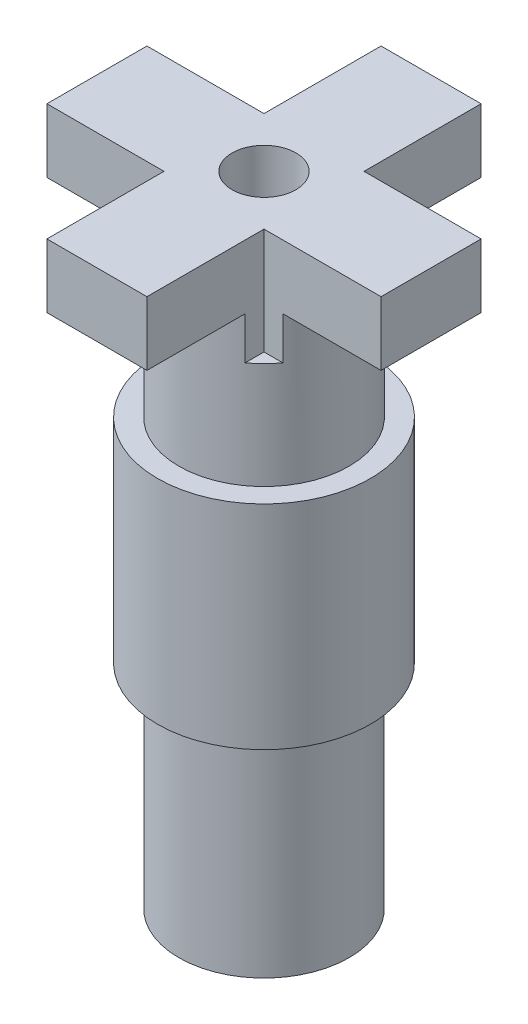
ISO-10303-21;
HEADER;
FILE_DESCRIPTION(('STEP AP214'),'2;1');
FILE_NAME('part.step','',(''),(''),'','','');
FILE_SCHEMA(('AUTOMOTIVE_DESIGN { 1 0 10303 214 1 1 1 1 }'));
ENDSEC;
DATA;
#1=APPLICATION_CONTEXT('core data for automotive mechanical design processes');
#2=APPLICATION_PROTOCOL_DEFINITION('international standard','automotive_design',2000,#1);
#3=PRODUCT_CONTEXT('',#1,'mechanical');
#4=PRODUCT('Part','Part','',(#3));
#5=PRODUCT_RELATED_PRODUCT_CATEGORY('part','',(#4));
#6=PRODUCT_DEFINITION_FORMATION('','',#4);
#7=PRODUCT_DEFINITION_CONTEXT('part definition',#1,'design');
#8=PRODUCT_DEFINITION('design','',#6,#7);
#9=PRODUCT_DEFINITION_SHAPE('','',#8);
#10=(LENGTH_UNIT() NAMED_UNIT(*) SI_UNIT(.MILLI.,.METRE.));
#11=(NAMED_UNIT(*) PLANE_ANGLE_UNIT() SI_UNIT($,.RADIAN.));
#12=(NAMED_UNIT(*) SI_UNIT($,.STERADIAN.) SOLID_ANGLE_UNIT());
#13=UNCERTAINTY_MEASURE_WITH_UNIT(LENGTH_MEASURE(1.E-05),#10,'distance_accuracy_value','');
#14=(GEOMETRIC_REPRESENTATION_CONTEXT(3) GLOBAL_UNCERTAINTY_ASSIGNED_CONTEXT((#13)) GLOBAL_UNIT_ASSIGNED_CONTEXT((#10,
#11,#12)) REPRESENTATION_CONTEXT('',''));
#15=CARTESIAN_POINT('',(0.,0.,0.));
#16=DIRECTION('',(0.,0.,1.));
#17=DIRECTION('',(1.,0.,0.));
#18=AXIS2_PLACEMENT_3D('',#15,#16,#17);
#19=CARTESIAN_POINT('',(0.,20.,0.));
#20=DIRECTION('',(0.,-1.,0.));
#21=DIRECTION('',(0.,0.,-1.));
#22=AXIS2_PLACEMENT_3D('',#19,#20,#21);
#23=CYLINDRICAL_SURFACE('',#22,4.);
#24=CARTESIAN_POINT('',(0.,10.,0.));
#25=DIRECTION('',(0.,1.,0.));
#26=DIRECTION('',(0.,0.,1.));
#27=AXIS2_PLACEMENT_3D('',#24,#25,#26);
#28=CIRCLE('',#27,4.);
#29=CARTESIAN_POINT('',(0.,10.,4.));
#30=VERTEX_POINT('',#29);
#31=EDGE_CURVE('E243',#30,#30,#28,.T.);
#32=ORIENTED_EDGE('',*,*,#31,.T.);
#33=EDGE_LOOP('',(#32));
#34=FACE_BOUND('',#33,.T.);
#35=DIRECTION('',(0.,1.,0.));
#36=VECTOR('',#35,1.);
#37=CARTESIAN_POINT('',(-2.35,15.,-3.2368966619279));
#38=LINE('',#37,#36);
#39=CARTESIAN_POINT('',(-2.35,15.,-3.2368966619279));
#40=VERTEX_POINT('',#39);
#41=CARTESIAN_POINT('',(-2.35,17.,-3.2368966619279));
#42=VERTEX_POINT('',#41);
#43=EDGE_CURVE('E423',#40,#42,#38,.T.);
#44=ORIENTED_EDGE('',*,*,#43,.T.);
#45=CARTESIAN_POINT('',(0.,17.,0.));
#46=DIRECTION('',(0.,1.,0.));
#47=DIRECTION('',(0.,0.,1.));
#48=AXIS2_PLACEMENT_3D('',#45,#46,#47);
#49=CIRCLE('',#48,4.);
#50=CARTESIAN_POINT('',(2.35,17.,-3.2368966619279));
#51=VERTEX_POINT('',#50);
#52=EDGE_CURVE('E57',#51,#42,#49,.T.);
#53=ORIENTED_EDGE('',*,*,#52,.F.);
#54=DIRECTION('',(0.,1.,0.));
#55=VECTOR('',#54,1.);
#56=CARTESIAN_POINT('',(2.35,15.,-3.2368966619279));
#57=LINE('',#56,#55);
#58=CARTESIAN_POINT('',(2.35,15.,-3.2368966619279));
#59=VERTEX_POINT('',#58);
#60=EDGE_CURVE('E370',#59,#51,#57,.T.);
#61=ORIENTED_EDGE('',*,*,#60,.F.);
#62=CARTESIAN_POINT('',(0.,15.,0.));
#63=DIRECTION('',(0.,1.,0.));
#64=DIRECTION('',(0.,0.,1.));
#65=AXIS2_PLACEMENT_3D('',#62,#63,#64);
#66=CIRCLE('',#65,4.);
#67=CARTESIAN_POINT('',(3.2368966619279,15.,-2.35));
#68=VERTEX_POINT('',#67);
#69=EDGE_CURVE('E397',#68,#59,#66,.T.);
#70=ORIENTED_EDGE('',*,*,#69,.F.);
#71=DIRECTION('',(0.,1.,0.));
#72=VECTOR('',#71,1.);
#73=CARTESIAN_POINT('',(3.2368966619279,15.,-2.35));
#74=LINE('',#73,#72);
#75=CARTESIAN_POINT('',(3.2368966619279,17.,-2.35));
#76=VERTEX_POINT('',#75);
#77=EDGE_CURVE('E405',#68,#76,#74,.T.);
#78=ORIENTED_EDGE('',*,*,#77,.T.);
#79=CARTESIAN_POINT('',(3.2368966619279,17.,2.35));
#80=VERTEX_POINT('',#79);
#81=EDGE_CURVE('E11',#80,#76,#49,.T.);
#82=ORIENTED_EDGE('',*,*,#81,.F.);
#83=DIRECTION('',(0.,1.,0.));
#84=VECTOR('',#83,1.);
#85=CARTESIAN_POINT('',(3.2368966619279,15.,2.35));
#86=LINE('',#85,#84);
#87=CARTESIAN_POINT('',(3.2368966619279,15.,2.35));
#88=VERTEX_POINT('',#87);
#89=EDGE_CURVE('E64',#88,#80,#86,.T.);
#90=ORIENTED_EDGE('',*,*,#89,.F.);
#91=CARTESIAN_POINT('',(0.,15.,0.));
#92=DIRECTION('',(0.,1.,0.));
#93=DIRECTION('',(0.,0.,1.));
#94=AXIS2_PLACEMENT_3D('',#91,#92,#93);
#95=CIRCLE('',#94,4.);
#96=CARTESIAN_POINT('',(2.35,15.,3.2368966619279));
#97=VERTEX_POINT('',#96);
#98=EDGE_CURVE('E369',#97,#88,#95,.T.);
#99=ORIENTED_EDGE('',*,*,#98,.F.);
#100=DIRECTION('',(0.,1.,0.));
#101=VECTOR('',#100,1.);
#102=CARTESIAN_POINT('',(2.35,15.,3.2368966619279));
#103=LINE('',#102,#101);
#104=CARTESIAN_POINT('',(2.35,17.,3.2368966619279));
#105=VERTEX_POINT('',#104);
#106=EDGE_CURVE('E378',#97,#105,#103,.T.);
#107=ORIENTED_EDGE('',*,*,#106,.T.);
#108=CARTESIAN_POINT('',(-2.35,17.,3.2368966619279));
#109=VERTEX_POINT('',#108);
#110=EDGE_CURVE('E51',#109,#105,#49,.T.);
#111=ORIENTED_EDGE('',*,*,#110,.F.);
#112=DIRECTION('',(0.,1.,0.));
#113=VECTOR('',#112,1.);
#114=CARTESIAN_POINT('',(-2.35,15.,3.2368966619279));
#115=LINE('',#114,#113);
#116=CARTESIAN_POINT('',(-2.35,15.,3.2368966619279));
#117=VERTEX_POINT('',#116);
#118=EDGE_CURVE('E176',#117,#109,#115,.T.);
#119=ORIENTED_EDGE('',*,*,#118,.F.);
#120=CARTESIAN_POINT('',(0.,15.,0.));
#121=DIRECTION('',(0.,1.,0.));
#122=DIRECTION('',(0.,0.,1.));
#123=AXIS2_PLACEMENT_3D('',#120,#121,#122);
#124=CIRCLE('',#123,4.);
#125=CARTESIAN_POINT('',(-3.2368966619279,15.,2.35));
#126=VERTEX_POINT('',#125);
#127=EDGE_CURVE('E441',#126,#117,#124,.T.);
#128=ORIENTED_EDGE('',*,*,#127,.F.);
#129=DIRECTION('',(0.,1.,0.));
#130=VECTOR('',#129,1.);
#131=CARTESIAN_POINT('',(-3.2368966619279,15.,2.35));
#132=LINE('',#131,#130);
#133=CARTESIAN_POINT('',(-3.2368966619279,17.,2.35));
#134=VERTEX_POINT('',#133);
#135=EDGE_CURVE('E449',#126,#134,#132,.T.);
#136=ORIENTED_EDGE('',*,*,#135,.T.);
#137=CARTESIAN_POINT('',(-3.2368966619279,17.,-2.35));
#138=VERTEX_POINT('',#137);
#139=EDGE_CURVE('E160',#138,#134,#49,.T.);
#140=ORIENTED_EDGE('',*,*,#139,.F.);
#141=DIRECTION('',(0.,1.,0.));
#142=VECTOR('',#141,1.);
#143=CARTESIAN_POINT('',(-3.2368966619279,15.,-2.35));
#144=LINE('',#143,#142);
#145=CARTESIAN_POINT('',(-3.2368966619279,15.,-2.35));
#146=VERTEX_POINT('',#145);
#147=EDGE_CURVE('E427',#146,#138,#144,.T.);
#148=ORIENTED_EDGE('',*,*,#147,.F.);
#149=CARTESIAN_POINT('',(0.,15.,0.));
#150=DIRECTION('',(0.,1.,0.));
#151=DIRECTION('',(0.,0.,1.));
#152=AXIS2_PLACEMENT_3D('',#149,#150,#151);
#153=CIRCLE('',#152,4.);
#154=EDGE_CURVE('E415',#40,#146,#153,.T.);
#155=ORIENTED_EDGE('',*,*,#154,.F.);
#156=EDGE_LOOP('',(#44,#53,#61,#70,#78,#82,#90,#99,#107,#111,#119,#128,#136,#140,#148,#155));
#157=FACE_BOUND('',#156,.T.);
#158=ADVANCED_FACE('F47',(#34,#157),#23,.T.);
#159=CARTESIAN_POINT('',(0.,20.,0.));
#160=DIRECTION('',(0.,1.,0.));
#161=DIRECTION('',(0.,0.,1.));
#162=AXIS2_PLACEMENT_3D('',#159,#160,#161);
#163=PLANE('',#162);
#164=CARTESIAN_POINT('',(0.,20.,0.));
#165=DIRECTION('',(0.,1.,0.));
#166=DIRECTION('',(0.,0.,1.));
#167=AXIS2_PLACEMENT_3D('',#164,#165,#166);
#168=CIRCLE('',#167,1.5);
#169=CARTESIAN_POINT('',(0.,20.,1.5));
#170=VERTEX_POINT('',#169);
#171=EDGE_CURVE('E358',#170,#170,#168,.T.);
#172=ORIENTED_EDGE('',*,*,#171,.F.);
#173=EDGE_LOOP('',(#172));
#174=FACE_BOUND('',#173,.T.);
#175=DIRECTION('',(0.,0.,1.));
#176=VECTOR('',#175,1.);
#177=CARTESIAN_POINT('',(-2.35,20.,0.));
#178=LINE('',#177,#176);
#179=CARTESIAN_POINT('',(-2.35,20.,-7.85));
#180=VERTEX_POINT('',#179);
#181=CARTESIAN_POINT('',(-2.35,20.,-2.35));
#182=VERTEX_POINT('',#181);
#183=EDGE_CURVE('E193',#180,#182,#178,.T.);
#184=ORIENTED_EDGE('',*,*,#183,.T.);
#185=DIRECTION('',(1.,0.,0.));
#186=VECTOR('',#185,1.);
#187=CARTESIAN_POINT('',(0.,20.,-2.35));
#188=LINE('',#187,#186);
#189=CARTESIAN_POINT('',(-7.85,20.,-2.35));
#190=VERTEX_POINT('',#189);
#191=EDGE_CURVE('E197',#190,#182,#188,.T.);
#192=ORIENTED_EDGE('',*,*,#191,.F.);
#193=DIRECTION('',(0.,0.,-1.));
#194=VECTOR('',#193,1.);
#195=CARTESIAN_POINT('',(-7.85,20.,0.));
#196=LINE('',#195,#194);
#197=CARTESIAN_POINT('',(-7.85,20.,2.35));
#198=VERTEX_POINT('',#197);
#199=EDGE_CURVE('E201',#198,#190,#196,.T.);
#200=ORIENTED_EDGE('',*,*,#199,.F.);
#201=DIRECTION('',(1.,0.,0.));
#202=VECTOR('',#201,1.);
#203=CARTESIAN_POINT('',(0.,20.,2.35));
#204=LINE('',#203,#202);
#205=CARTESIAN_POINT('',(-2.35,20.,2.35));
#206=VERTEX_POINT('',#205);
#207=EDGE_CURVE('E140',#198,#206,#204,.T.);
#208=ORIENTED_EDGE('',*,*,#207,.T.);
#209=DIRECTION('',(0.,0.,1.));
#210=VECTOR('',#209,1.);
#211=CARTESIAN_POINT('',(-2.35,20.,0.));
#212=LINE('',#211,#210);
#213=CARTESIAN_POINT('',(-2.35,20.,7.85));
#214=VERTEX_POINT('',#213);
#215=EDGE_CURVE('E206',#206,#214,#212,.T.);
#216=ORIENTED_EDGE('',*,*,#215,.T.);
#217=DIRECTION('',(1.,0.,0.));
#218=VECTOR('',#217,1.);
#219=CARTESIAN_POINT('',(0.,20.,7.85));
#220=LINE('',#219,#218);
#221=CARTESIAN_POINT('',(2.35,20.,7.85));
#222=VERTEX_POINT('',#221);
#223=EDGE_CURVE('E209',#214,#222,#220,.T.);
#224=ORIENTED_EDGE('',*,*,#223,.T.);
#225=DIRECTION('',(0.,0.,1.));
#226=VECTOR('',#225,1.);
#227=CARTESIAN_POINT('',(2.35,20.,0.));
#228=LINE('',#227,#226);
#229=CARTESIAN_POINT('',(2.35,20.,2.35));
#230=VERTEX_POINT('',#229);
#231=EDGE_CURVE('E107',#230,#222,#228,.T.);
#232=ORIENTED_EDGE('',*,*,#231,.F.);
#233=DIRECTION('',(1.,0.,0.));
#234=VECTOR('',#233,1.);
#235=CARTESIAN_POINT('',(0.,20.,2.35));
#236=LINE('',#235,#234);
#237=CARTESIAN_POINT('',(7.85,20.,2.35));
#238=VERTEX_POINT('',#237);
#239=EDGE_CURVE('E175',#230,#238,#236,.T.);
#240=ORIENTED_EDGE('',*,*,#239,.T.);
#241=DIRECTION('',(0.,0.,-1.));
#242=VECTOR('',#241,1.);
#243=CARTESIAN_POINT('',(7.85,20.,0.));
#244=LINE('',#243,#242);
#245=CARTESIAN_POINT('',(7.85,20.,-2.35));
#246=VERTEX_POINT('',#245);
#247=EDGE_CURVE('E179',#238,#246,#244,.T.);
#248=ORIENTED_EDGE('',*,*,#247,.T.);
#249=DIRECTION('',(1.,0.,0.));
#250=VECTOR('',#249,1.);
#251=CARTESIAN_POINT('',(0.,20.,-2.35));
#252=LINE('',#251,#250);
#253=CARTESIAN_POINT('',(2.35,20.,-2.35));
#254=VERTEX_POINT('',#253);
#255=EDGE_CURVE('E183',#254,#246,#252,.T.);
#256=ORIENTED_EDGE('',*,*,#255,.F.);
#257=DIRECTION('',(0.,0.,1.));
#258=VECTOR('',#257,1.);
#259=CARTESIAN_POINT('',(2.35,20.,0.));
#260=LINE('',#259,#258);
#261=CARTESIAN_POINT('',(2.35,20.,-7.85));
#262=VERTEX_POINT('',#261);
#263=EDGE_CURVE('E186',#262,#254,#260,.T.);
#264=ORIENTED_EDGE('',*,*,#263,.F.);
#265=DIRECTION('',(1.,0.,0.));
#266=VECTOR('',#265,1.);
#267=CARTESIAN_POINT('',(0.,20.,-7.85));
#268=LINE('',#267,#266);
#269=EDGE_CURVE('E190',#180,#262,#268,.T.);
#270=ORIENTED_EDGE('',*,*,#269,.F.);
#271=EDGE_LOOP('',(#184,#192,#200,#208,#216,#224,#232,#240,#248,#256,#264,#270));
#272=FACE_BOUND('',#271,.T.);
#273=ADVANCED_FACE('F271',(#174,#272),#163,.T.);
#274=CARTESIAN_POINT('',(0.,10.,0.));
#275=DIRECTION('',(0.,-1.,0.));
#276=DIRECTION('',(0.,0.,-1.));
#277=AXIS2_PLACEMENT_3D('',#274,#275,#276);
#278=CYLINDRICAL_SURFACE('',#277,5.);
#279=CARTESIAN_POINT('',(0.,10.,0.));
#280=DIRECTION('',(0.,1.,0.));
#281=DIRECTION('',(0.,0.,1.));
#282=AXIS2_PLACEMENT_3D('',#279,#280,#281);
#283=CIRCLE('',#282,5.);
#284=CARTESIAN_POINT('',(0.,10.,5.));
#285=VERTEX_POINT('',#284);
#286=EDGE_CURVE('E247',#285,#285,#283,.T.);
#287=ORIENTED_EDGE('',*,*,#286,.F.);
#288=EDGE_LOOP('',(#287));
#289=FACE_BOUND('',#288,.T.);
#290=CARTESIAN_POINT('',(0.,0.,0.));
#291=DIRECTION('',(0.,1.,0.));
#292=DIRECTION('',(0.,0.,1.));
#293=AXIS2_PLACEMENT_3D('',#290,#291,#292);
#294=CIRCLE('',#293,5.);
#295=CARTESIAN_POINT('',(0.,0.,5.));
#296=VERTEX_POINT('',#295);
#297=EDGE_CURVE('E238',#296,#296,#294,.T.);
#298=ORIENTED_EDGE('',*,*,#297,.T.);
#299=EDGE_LOOP('',(#298));
#300=FACE_BOUND('',#299,.T.);
#301=ADVANCED_FACE('F49',(#289,#300),#278,.T.);
#302=CARTESIAN_POINT('',(0.,10.,0.));
#303=DIRECTION('',(0.,1.,0.));
#304=DIRECTION('',(0.,0.,1.));
#305=AXIS2_PLACEMENT_3D('',#302,#303,#304);
#306=PLANE('',#305);
#307=ORIENTED_EDGE('',*,*,#31,.F.);
#308=EDGE_LOOP('',(#307));
#309=FACE_BOUND('',#308,.T.);
#310=ORIENTED_EDGE('',*,*,#286,.T.);
#311=EDGE_LOOP('',(#310));
#312=FACE_BOUND('',#311,.T.);
#313=ADVANCED_FACE('F258',(#309,#312),#306,.T.);
#314=CARTESIAN_POINT('',(0.,0.,0.));
#315=DIRECTION('',(0.,1.,0.));
#316=DIRECTION('',(0.,0.,1.));
#317=AXIS2_PLACEMENT_3D('',#314,#315,#316);
#318=PLANE('',#317);
#319=CARTESIAN_POINT('',(0.,0.,0.));
#320=DIRECTION('',(0.,-1.,0.));
#321=DIRECTION('',(0.,0.,-1.));
#322=AXIS2_PLACEMENT_3D('',#319,#320,#321);
#323=CIRCLE('',#322,4.);
#324=CARTESIAN_POINT('',(0.,0.,-4.));
#325=VERTEX_POINT('',#324);
#326=EDGE_CURVE('E239',#325,#325,#323,.T.);
#327=ORIENTED_EDGE('',*,*,#326,.F.);
#328=EDGE_LOOP('',(#327));
#329=FACE_BOUND('',#328,.T.);
#330=ORIENTED_EDGE('',*,*,#297,.F.);
#331=EDGE_LOOP('',(#330));
#332=FACE_BOUND('',#331,.T.);
#333=ADVANCED_FACE('F255',(#329,#332),#318,.F.);
#334=CARTESIAN_POINT('',(0.,-10.,0.));
#335=DIRECTION('',(0.,1.,0.));
#336=DIRECTION('',(0.,0.,1.));
#337=AXIS2_PLACEMENT_3D('',#334,#335,#336);
#338=CYLINDRICAL_SURFACE('',#337,4.);
#339=CARTESIAN_POINT('',(0.,-10.,0.));
#340=DIRECTION('',(0.,-1.,0.));
#341=DIRECTION('',(0.,0.,-1.));
#342=AXIS2_PLACEMENT_3D('',#339,#340,#341);
#343=CIRCLE('',#342,4.);
#344=CARTESIAN_POINT('',(0.,-10.,-4.));
#345=VERTEX_POINT('',#344);
#346=EDGE_CURVE('E216',#345,#345,#343,.T.);
#347=ORIENTED_EDGE('',*,*,#346,.F.);
#348=EDGE_LOOP('',(#347));
#349=FACE_BOUND('',#348,.T.);
#350=ORIENTED_EDGE('',*,*,#326,.T.);
#351=EDGE_LOOP('',(#350));
#352=FACE_BOUND('',#351,.T.);
#353=ADVANCED_FACE('F257',(#349,#352),#338,.T.);
#354=CARTESIAN_POINT('',(0.,-10.,0.));
#355=DIRECTION('',(0.,-1.,0.));
#356=DIRECTION('',(0.,0.,-1.));
#357=AXIS2_PLACEMENT_3D('',#354,#355,#356);
#358=PLANE('',#357);
#359=CARTESIAN_POINT('',(0.,-10.,0.));
#360=DIRECTION('',(0.,1.,0.));
#361=DIRECTION('',(0.,0.,1.));
#362=AXIS2_PLACEMENT_3D('',#359,#360,#361);
#363=CIRCLE('',#362,1.5);
#364=CARTESIAN_POINT('',(0.,-10.,1.5));
#365=VERTEX_POINT('',#364);
#366=EDGE_CURVE('E355',#365,#365,#363,.T.);
#367=ORIENTED_EDGE('',*,*,#366,.T.);
#368=EDGE_LOOP('',(#367));
#369=FACE_BOUND('',#368,.T.);
#370=ORIENTED_EDGE('',*,*,#346,.T.);
#371=EDGE_LOOP('',(#370));
#372=FACE_BOUND('',#371,.T.);
#373=ADVANCED_FACE('F264',(#369,#372),#358,.T.);
#374=CARTESIAN_POINT('',(0.,17.,7.85));
#375=DIRECTION('',(0.,0.,1.));
#376=DIRECTION('',(1.,0.,0.));
#377=AXIS2_PLACEMENT_3D('',#374,#375,#376);
#378=PLANE('',#377);
#379=ORIENTED_EDGE('',*,*,#223,.F.);
#380=DIRECTION('',(0.,1.,0.));
#381=VECTOR('',#380,1.);
#382=CARTESIAN_POINT('',(-2.35,17.,7.85));
#383=LINE('',#382,#381);
#384=CARTESIAN_POINT('',(-2.35,17.,7.85));
#385=VERTEX_POINT('',#384);
#386=EDGE_CURVE('E144',#385,#214,#383,.T.);
#387=ORIENTED_EDGE('',*,*,#386,.F.);
#388=DIRECTION('',(1.,0.,0.));
#389=VECTOR('',#388,1.);
#390=CARTESIAN_POINT('',(0.,17.,7.85));
#391=LINE('',#390,#389);
#392=CARTESIAN_POINT('',(2.35,17.,7.85));
#393=VERTEX_POINT('',#392);
#394=EDGE_CURVE('E165',#385,#393,#391,.T.);
#395=ORIENTED_EDGE('',*,*,#394,.T.);
#396=DIRECTION('',(0.,1.,0.));
#397=VECTOR('',#396,1.);
#398=CARTESIAN_POINT('',(2.35,17.,7.85));
#399=LINE('',#398,#397);
#400=EDGE_CURVE('E213',#393,#222,#399,.T.);
#401=ORIENTED_EDGE('',*,*,#400,.T.);
#402=EDGE_LOOP('',(#379,#387,#395,#401));
#403=FACE_BOUND('',#402,.T.);
#404=ADVANCED_FACE('F285',(#403),#378,.T.);
#405=CARTESIAN_POINT('',(0.,17.,0.));
#406=DIRECTION('',(0.,1.,0.));
#407=DIRECTION('',(0.,0.,1.));
#408=AXIS2_PLACEMENT_3D('',#405,#406,#407);
#409=PLANE('',#408);
#410=DIRECTION('',(0.,0.,1.));
#411=VECTOR('',#410,1.);
#412=CARTESIAN_POINT('',(-2.35,17.,0.));
#413=LINE('',#412,#411);
#414=EDGE_CURVE('E162',#109,#385,#413,.T.);
#415=ORIENTED_EDGE('',*,*,#414,.F.);
#416=ORIENTED_EDGE('',*,*,#110,.T.);
#417=DIRECTION('',(0.,0.,1.));
#418=VECTOR('',#417,1.);
#419=CARTESIAN_POINT('',(2.35,17.,0.));
#420=LINE('',#419,#418);
#421=EDGE_CURVE('E73',#105,#393,#420,.T.);
#422=ORIENTED_EDGE('',*,*,#421,.T.);
#423=ORIENTED_EDGE('',*,*,#394,.F.);
#424=EDGE_LOOP('',(#415,#416,#422,#423));
#425=FACE_BOUND('',#424,.T.);
#426=ADVANCED_FACE('F326',(#425),#409,.F.);
#427=CARTESIAN_POINT('',(-2.35,17.,0.));
#428=DIRECTION('',(-1.,0.,0.));
#429=DIRECTION('',(0.,0.,1.));
#430=AXIS2_PLACEMENT_3D('',#427,#428,#429);
#431=PLANE('',#430);
#432=ORIENTED_EDGE('',*,*,#215,.F.);
#433=DIRECTION('',(0.,1.,0.));
#434=VECTOR('',#433,1.);
#435=CARTESIAN_POINT('',(-2.35,15.,2.35));
#436=LINE('',#435,#434);
#437=CARTESIAN_POINT('',(-2.35,15.,2.35));
#438=VERTEX_POINT('',#437);
#439=EDGE_CURVE('E445',#438,#206,#436,.T.);
#440=ORIENTED_EDGE('',*,*,#439,.F.);
#441=DIRECTION('',(0.,0.,1.));
#442=VECTOR('',#441,1.);
#443=CARTESIAN_POINT('',(-2.35,15.,0.));
#444=LINE('',#443,#442);
#445=EDGE_CURVE('E382',#438,#117,#444,.T.);
#446=ORIENTED_EDGE('',*,*,#445,.T.);
#447=ORIENTED_EDGE('',*,*,#118,.T.);
#448=ORIENTED_EDGE('',*,*,#414,.T.);
#449=ORIENTED_EDGE('',*,*,#386,.T.);
#450=EDGE_LOOP('',(#432,#440,#446,#447,#448,#449));
#451=FACE_BOUND('',#450,.T.);
#452=ADVANCED_FACE('F290',(#451),#431,.T.);
#453=CARTESIAN_POINT('',(2.35,17.,0.));
#454=DIRECTION('',(-1.,0.,0.));
#455=DIRECTION('',(0.,0.,1.));
#456=AXIS2_PLACEMENT_3D('',#453,#454,#455);
#457=PLANE('',#456);
#458=ORIENTED_EDGE('',*,*,#421,.F.);
#459=ORIENTED_EDGE('',*,*,#106,.F.);
#460=DIRECTION('',(0.,0.,-1.));
#461=VECTOR('',#460,1.);
#462=CARTESIAN_POINT('',(2.35,15.,0.));
#463=LINE('',#462,#461);
#464=CARTESIAN_POINT('',(2.35,15.,2.35));
#465=VERTEX_POINT('',#464);
#466=EDGE_CURVE('E365',#97,#465,#463,.T.);
#467=ORIENTED_EDGE('',*,*,#466,.T.);
#468=DIRECTION('',(0.,1.,0.));
#469=VECTOR('',#468,1.);
#470=CARTESIAN_POINT('',(2.35,15.,2.35));
#471=LINE('',#470,#469);
#472=EDGE_CURVE('E379',#465,#230,#471,.T.);
#473=ORIENTED_EDGE('',*,*,#472,.T.);
#474=ORIENTED_EDGE('',*,*,#231,.T.);
#475=ORIENTED_EDGE('',*,*,#400,.F.);
#476=EDGE_LOOP('',(#458,#459,#467,#473,#474,#475));
#477=FACE_BOUND('',#476,.T.);
#478=ADVANCED_FACE('F287',(#477),#457,.F.);
#479=CARTESIAN_POINT('',(-7.85,17.,0.));
#480=DIRECTION('',(1.,0.,0.));
#481=DIRECTION('',(0.,0.,-1.));
#482=AXIS2_PLACEMENT_3D('',#479,#480,#481);
#483=PLANE('',#482);
#484=ORIENTED_EDGE('',*,*,#199,.T.);
#485=DIRECTION('',(0.,1.,0.));
#486=VECTOR('',#485,1.);
#487=CARTESIAN_POINT('',(-7.85,17.,-2.35));
#488=LINE('',#487,#486);
#489=CARTESIAN_POINT('',(-7.85,17.,-2.35));
#490=VERTEX_POINT('',#489);
#491=EDGE_CURVE('E145',#490,#190,#488,.T.);
#492=ORIENTED_EDGE('',*,*,#491,.F.);
#493=DIRECTION('',(0.,0.,-1.));
#494=VECTOR('',#493,1.);
#495=CARTESIAN_POINT('',(-7.85,17.,0.));
#496=LINE('',#495,#494);
#497=CARTESIAN_POINT('',(-7.85,17.,2.35));
#498=VERTEX_POINT('',#497);
#499=EDGE_CURVE('E148',#498,#490,#496,.T.);
#500=ORIENTED_EDGE('',*,*,#499,.F.);
#501=DIRECTION('',(0.,1.,0.));
#502=VECTOR('',#501,1.);
#503=CARTESIAN_POINT('',(-7.85,17.,2.35));
#504=LINE('',#503,#502);
#505=EDGE_CURVE('E131',#498,#198,#504,.T.);
#506=ORIENTED_EDGE('',*,*,#505,.T.);
#507=EDGE_LOOP('',(#484,#492,#500,#506));
#508=FACE_BOUND('',#507,.T.);
#509=ADVANCED_FACE('F149',(#508),#483,.F.);
#510=DIRECTION('',(1.,0.,0.));
#511=VECTOR('',#510,1.);
#512=CARTESIAN_POINT('',(0.,17.,-2.35));
#513=LINE('',#512,#511);
#514=EDGE_CURVE('E155',#490,#138,#513,.T.);
#515=ORIENTED_EDGE('',*,*,#514,.T.);
#516=ORIENTED_EDGE('',*,*,#139,.T.);
#517=DIRECTION('',(1.,0.,0.));
#518=VECTOR('',#517,1.);
#519=CARTESIAN_POINT('',(0.,17.,2.35));
#520=LINE('',#519,#518);
#521=EDGE_CURVE('E137',#498,#134,#520,.T.);
#522=ORIENTED_EDGE('',*,*,#521,.F.);
#523=ORIENTED_EDGE('',*,*,#499,.T.);
#524=EDGE_LOOP('',(#515,#516,#522,#523));
#525=FACE_BOUND('',#524,.T.);
#526=ADVANCED_FACE('F158',(#525),#409,.F.);
#527=CARTESIAN_POINT('',(0.,17.,-2.35));
#528=DIRECTION('',(0.,0.,1.));
#529=DIRECTION('',(1.,0.,0.));
#530=AXIS2_PLACEMENT_3D('',#527,#528,#529);
#531=PLANE('',#530);
#532=ORIENTED_EDGE('',*,*,#191,.T.);
#533=DIRECTION('',(0.,1.,0.));
#534=VECTOR('',#533,1.);
#535=CARTESIAN_POINT('',(-2.35,15.,-2.35));
#536=LINE('',#535,#534);
#537=CARTESIAN_POINT('',(-2.35,15.,-2.35));
#538=VERTEX_POINT('',#537);
#539=EDGE_CURVE('E393',#538,#182,#536,.T.);
#540=ORIENTED_EDGE('',*,*,#539,.F.);
#541=DIRECTION('',(1.,0.,0.));
#542=VECTOR('',#541,1.);
#543=CARTESIAN_POINT('',(0.,15.,-2.35));
#544=LINE('',#543,#542);
#545=EDGE_CURVE('E419',#146,#538,#544,.T.);
#546=ORIENTED_EDGE('',*,*,#545,.F.);
#547=ORIENTED_EDGE('',*,*,#147,.T.);
#548=ORIENTED_EDGE('',*,*,#514,.F.);
#549=ORIENTED_EDGE('',*,*,#491,.T.);
#550=EDGE_LOOP('',(#532,#540,#546,#547,#548,#549));
#551=FACE_BOUND('',#550,.T.);
#552=ADVANCED_FACE('F316',(#551),#531,.F.);
#553=CARTESIAN_POINT('',(0.,17.,2.35));
#554=DIRECTION('',(0.,0.,1.));
#555=DIRECTION('',(1.,0.,0.));
#556=AXIS2_PLACEMENT_3D('',#553,#554,#555);
#557=PLANE('',#556);
#558=ORIENTED_EDGE('',*,*,#521,.T.);
#559=ORIENTED_EDGE('',*,*,#135,.F.);
#560=DIRECTION('',(-1.,0.,0.));
#561=VECTOR('',#560,1.);
#562=CARTESIAN_POINT('',(0.,15.,2.35));
#563=LINE('',#562,#561);
#564=EDGE_CURVE('E437',#438,#126,#563,.T.);
#565=ORIENTED_EDGE('',*,*,#564,.F.);
#566=ORIENTED_EDGE('',*,*,#439,.T.);
#567=ORIENTED_EDGE('',*,*,#207,.F.);
#568=ORIENTED_EDGE('',*,*,#505,.F.);
#569=EDGE_LOOP('',(#558,#559,#565,#566,#567,#568));
#570=FACE_BOUND('',#569,.T.);
#571=ADVANCED_FACE('F133',(#570),#557,.T.);
#572=CARTESIAN_POINT('',(0.,17.,-7.85));
#573=DIRECTION('',(0.,0.,1.));
#574=DIRECTION('',(1.,0.,0.));
#575=AXIS2_PLACEMENT_3D('',#572,#573,#574);
#576=PLANE('',#575);
#577=ORIENTED_EDGE('',*,*,#269,.T.);
#578=DIRECTION('',(0.,1.,0.));
#579=VECTOR('',#578,1.);
#580=CARTESIAN_POINT('',(2.35,17.,-7.85));
#581=LINE('',#580,#579);
#582=CARTESIAN_POINT('',(2.35,17.,-7.85));
#583=VERTEX_POINT('',#582);
#584=EDGE_CURVE('E225',#583,#262,#581,.T.);
#585=ORIENTED_EDGE('',*,*,#584,.F.);
#586=DIRECTION('',(1.,0.,0.));
#587=VECTOR('',#586,1.);
#588=CARTESIAN_POINT('',(0.,17.,-7.85));
#589=LINE('',#588,#587);
#590=CARTESIAN_POINT('',(-2.35,17.,-7.85));
#591=VERTEX_POINT('',#590);
#592=EDGE_CURVE('E470',#591,#583,#589,.T.);
#593=ORIENTED_EDGE('',*,*,#592,.F.);
#594=DIRECTION('',(0.,1.,0.));
#595=VECTOR('',#594,1.);
#596=CARTESIAN_POINT('',(-2.35,17.,-7.85));
#597=LINE('',#596,#595);
#598=EDGE_CURVE('E222',#591,#180,#597,.T.);
#599=ORIENTED_EDGE('',*,*,#598,.T.);
#600=EDGE_LOOP('',(#577,#585,#593,#599));
#601=FACE_BOUND('',#600,.T.);
#602=ADVANCED_FACE('F309',(#601),#576,.F.);
#603=DIRECTION('',(0.,0.,1.));
#604=VECTOR('',#603,1.);
#605=CARTESIAN_POINT('',(2.35,17.,0.));
#606=LINE('',#605,#604);
#607=EDGE_CURVE('E466',#583,#51,#606,.T.);
#608=ORIENTED_EDGE('',*,*,#607,.T.);
#609=ORIENTED_EDGE('',*,*,#52,.T.);
#610=DIRECTION('',(0.,0.,1.));
#611=VECTOR('',#610,1.);
#612=CARTESIAN_POINT('',(-2.35,17.,0.));
#613=LINE('',#612,#611);
#614=EDGE_CURVE('E473',#591,#42,#613,.T.);
#615=ORIENTED_EDGE('',*,*,#614,.F.);
#616=ORIENTED_EDGE('',*,*,#592,.T.);
#617=EDGE_LOOP('',(#608,#609,#615,#616));
#618=FACE_BOUND('',#617,.T.);
#619=ADVANCED_FACE('F307',(#618),#409,.F.);
#620=CARTESIAN_POINT('',(2.35,17.,0.));
#621=DIRECTION('',(-1.,0.,0.));
#622=DIRECTION('',(0.,0.,1.));
#623=AXIS2_PLACEMENT_3D('',#620,#621,#622);
#624=PLANE('',#623);
#625=ORIENTED_EDGE('',*,*,#263,.T.);
#626=DIRECTION('',(0.,1.,0.));
#627=VECTOR('',#626,1.);
#628=CARTESIAN_POINT('',(2.35,15.,-2.35));
#629=LINE('',#628,#627);
#630=CARTESIAN_POINT('',(2.35,15.,-2.35));
#631=VERTEX_POINT('',#630);
#632=EDGE_CURVE('E401',#631,#254,#629,.T.);
#633=ORIENTED_EDGE('',*,*,#632,.F.);
#634=DIRECTION('',(0.,0.,-1.));
#635=VECTOR('',#634,1.);
#636=CARTESIAN_POINT('',(2.35,15.,0.));
#637=LINE('',#636,#635);
#638=EDGE_CURVE('E388',#631,#59,#637,.T.);
#639=ORIENTED_EDGE('',*,*,#638,.T.);
#640=ORIENTED_EDGE('',*,*,#60,.T.);
#641=ORIENTED_EDGE('',*,*,#607,.F.);
#642=ORIENTED_EDGE('',*,*,#584,.T.);
#643=EDGE_LOOP('',(#625,#633,#639,#640,#641,#642));
#644=FACE_BOUND('',#643,.T.);
#645=ADVANCED_FACE('F303',(#644),#624,.F.);
#646=CARTESIAN_POINT('',(-2.35,17.,0.));
#647=DIRECTION('',(-1.,0.,0.));
#648=DIRECTION('',(0.,0.,1.));
#649=AXIS2_PLACEMENT_3D('',#646,#647,#648);
#650=PLANE('',#649);
#651=ORIENTED_EDGE('',*,*,#614,.T.);
#652=ORIENTED_EDGE('',*,*,#43,.F.);
#653=DIRECTION('',(0.,0.,1.));
#654=VECTOR('',#653,1.);
#655=CARTESIAN_POINT('',(-2.35,15.,0.));
#656=LINE('',#655,#654);
#657=EDGE_CURVE('E362',#40,#538,#656,.T.);
#658=ORIENTED_EDGE('',*,*,#657,.T.);
#659=ORIENTED_EDGE('',*,*,#539,.T.);
#660=ORIENTED_EDGE('',*,*,#183,.F.);
#661=ORIENTED_EDGE('',*,*,#598,.F.);
#662=EDGE_LOOP('',(#651,#652,#658,#659,#660,#661));
#663=FACE_BOUND('',#662,.T.);
#664=ADVANCED_FACE('F306',(#663),#650,.T.);
#665=DIRECTION('',(1.,0.,0.));
#666=VECTOR('',#665,1.);
#667=CARTESIAN_POINT('',(0.,17.,2.35));
#668=LINE('',#667,#666);
#669=CARTESIAN_POINT('',(7.85,17.,2.35));
#670=VERTEX_POINT('',#669);
#671=EDGE_CURVE('E112',#80,#670,#668,.T.);
#672=ORIENTED_EDGE('',*,*,#671,.F.);
#673=ORIENTED_EDGE('',*,*,#81,.T.);
#674=DIRECTION('',(1.,0.,0.));
#675=VECTOR('',#674,1.);
#676=CARTESIAN_POINT('',(0.,17.,-2.35));
#677=LINE('',#676,#675);
#678=CARTESIAN_POINT('',(7.85,17.,-2.35));
#679=VERTEX_POINT('',#678);
#680=EDGE_CURVE('E463',#76,#679,#677,.T.);
#681=ORIENTED_EDGE('',*,*,#680,.T.);
#682=DIRECTION('',(0.,0.,-1.));
#683=VECTOR('',#682,1.);
#684=CARTESIAN_POINT('',(7.85,17.,0.));
#685=LINE('',#684,#683);
#686=EDGE_CURVE('E459',#670,#679,#685,.T.);
#687=ORIENTED_EDGE('',*,*,#686,.F.);
#688=EDGE_LOOP('',(#672,#673,#681,#687));
#689=FACE_BOUND('',#688,.T.);
#690=ADVANCED_FACE('F301',(#689),#409,.F.);
#691=CARTESIAN_POINT('',(0.,17.,-2.35));
#692=DIRECTION('',(0.,0.,1.));
#693=DIRECTION('',(1.,0.,0.));
#694=AXIS2_PLACEMENT_3D('',#691,#692,#693);
#695=PLANE('',#694);
#696=ORIENTED_EDGE('',*,*,#680,.F.);
#697=ORIENTED_EDGE('',*,*,#77,.F.);
#698=DIRECTION('',(1.,0.,0.));
#699=VECTOR('',#698,1.);
#700=CARTESIAN_POINT('',(0.,15.,-2.35));
#701=LINE('',#700,#699);
#702=EDGE_CURVE('E392',#631,#68,#701,.T.);
#703=ORIENTED_EDGE('',*,*,#702,.F.);
#704=ORIENTED_EDGE('',*,*,#632,.T.);
#705=ORIENTED_EDGE('',*,*,#255,.T.);
#706=DIRECTION('',(0.,1.,0.));
#707=VECTOR('',#706,1.);
#708=CARTESIAN_POINT('',(7.85,17.,-2.35));
#709=LINE('',#708,#707);
#710=EDGE_CURVE('E229',#679,#246,#709,.T.);
#711=ORIENTED_EDGE('',*,*,#710,.F.);
#712=EDGE_LOOP('',(#696,#697,#703,#704,#705,#711));
#713=FACE_BOUND('',#712,.T.);
#714=ADVANCED_FACE('F295',(#713),#695,.F.);
#715=CARTESIAN_POINT('',(0.,17.,2.35));
#716=DIRECTION('',(0.,0.,1.));
#717=DIRECTION('',(1.,0.,0.));
#718=AXIS2_PLACEMENT_3D('',#715,#716,#717);
#719=PLANE('',#718);
#720=ORIENTED_EDGE('',*,*,#239,.F.);
#721=ORIENTED_EDGE('',*,*,#472,.F.);
#722=DIRECTION('',(-1.,0.,0.));
#723=VECTOR('',#722,1.);
#724=CARTESIAN_POINT('',(0.,15.,2.35));
#725=LINE('',#724,#723);
#726=EDGE_CURVE('E374',#88,#465,#725,.T.);
#727=ORIENTED_EDGE('',*,*,#726,.F.);
#728=ORIENTED_EDGE('',*,*,#89,.T.);
#729=ORIENTED_EDGE('',*,*,#671,.T.);
#730=DIRECTION('',(0.,1.,0.));
#731=VECTOR('',#730,1.);
#732=CARTESIAN_POINT('',(7.85,17.,2.35));
#733=LINE('',#732,#731);
#734=EDGE_CURVE('E172',#670,#238,#733,.T.);
#735=ORIENTED_EDGE('',*,*,#734,.T.);
#736=EDGE_LOOP('',(#720,#721,#727,#728,#729,#735));
#737=FACE_BOUND('',#736,.T.);
#738=ADVANCED_FACE('F291',(#737),#719,.T.);
#739=CARTESIAN_POINT('',(7.85,17.,0.));
#740=DIRECTION('',(1.,0.,0.));
#741=DIRECTION('',(0.,0.,-1.));
#742=AXIS2_PLACEMENT_3D('',#739,#740,#741);
#743=PLANE('',#742);
#744=ORIENTED_EDGE('',*,*,#247,.F.);
#745=ORIENTED_EDGE('',*,*,#734,.F.);
#746=ORIENTED_EDGE('',*,*,#686,.T.);
#747=ORIENTED_EDGE('',*,*,#710,.T.);
#748=EDGE_LOOP('',(#744,#745,#746,#747));
#749=FACE_BOUND('',#748,.T.);
#750=ADVANCED_FACE('F294',(#749),#743,.T.);
#751=CARTESIAN_POINT('',(0.,15.,0.));
#752=DIRECTION('',(0.,1.,0.));
#753=DIRECTION('',(0.,0.,1.));
#754=AXIS2_PLACEMENT_3D('',#751,#752,#753);
#755=PLANE('',#754);
#756=ORIENTED_EDGE('',*,*,#466,.F.);
#757=ORIENTED_EDGE('',*,*,#98,.T.);
#758=ORIENTED_EDGE('',*,*,#726,.T.);
#759=EDGE_LOOP('',(#756,#757,#758));
#760=FACE_BOUND('',#759,.T.);
#761=ADVANCED_FACE('F297',(#760),#755,.T.);
#762=CARTESIAN_POINT('',(0.,15.,0.));
#763=DIRECTION('',(0.,1.,0.));
#764=DIRECTION('',(0.,0.,1.));
#765=AXIS2_PLACEMENT_3D('',#762,#763,#764);
#766=PLANE('',#765);
#767=ORIENTED_EDGE('',*,*,#638,.F.);
#768=ORIENTED_EDGE('',*,*,#702,.T.);
#769=ORIENTED_EDGE('',*,*,#69,.T.);
#770=EDGE_LOOP('',(#767,#768,#769));
#771=FACE_BOUND('',#770,.T.);
#772=ADVANCED_FACE('F340',(#771),#766,.T.);
#773=CARTESIAN_POINT('',(0.,15.,0.));
#774=DIRECTION('',(0.,1.,0.));
#775=DIRECTION('',(0.,0.,1.));
#776=AXIS2_PLACEMENT_3D('',#773,#774,#775);
#777=PLANE('',#776);
#778=ORIENTED_EDGE('',*,*,#657,.F.);
#779=ORIENTED_EDGE('',*,*,#154,.T.);
#780=ORIENTED_EDGE('',*,*,#545,.T.);
#781=EDGE_LOOP('',(#778,#779,#780));
#782=FACE_BOUND('',#781,.T.);
#783=ADVANCED_FACE('F336',(#782),#777,.T.);
#784=CARTESIAN_POINT('',(0.,15.,0.));
#785=DIRECTION('',(0.,1.,0.));
#786=DIRECTION('',(0.,0.,1.));
#787=AXIS2_PLACEMENT_3D('',#784,#785,#786);
#788=PLANE('',#787);
#789=ORIENTED_EDGE('',*,*,#445,.F.);
#790=ORIENTED_EDGE('',*,*,#564,.T.);
#791=ORIENTED_EDGE('',*,*,#127,.T.);
#792=EDGE_LOOP('',(#789,#790,#791));
#793=FACE_BOUND('',#792,.T.);
#794=ADVANCED_FACE('F332',(#793),#788,.T.);
#795=CARTESIAN_POINT('',(0.,-10.,0.));
#796=DIRECTION('',(0.,1.,0.));
#797=DIRECTION('',(0.,0.,1.));
#798=AXIS2_PLACEMENT_3D('',#795,#796,#797);
#799=CYLINDRICAL_SURFACE('',#798,1.5);
#800=ORIENTED_EDGE('',*,*,#366,.F.);
#801=EDGE_LOOP('',(#800));
#802=FACE_BOUND('',#801,.T.);
#803=ORIENTED_EDGE('',*,*,#171,.T.);
#804=EDGE_LOOP('',(#803));
#805=FACE_BOUND('',#804,.T.);
#806=ADVANCED_FACE('F335',(#802,#805),#799,.F.);
#807=CLOSED_SHELL('',(#158,#273,#301,#313,#333,#353,#373,#404,#426,#452,#478,#509,#526,#552,
#571,#602,#619,#645,#664,#690,#714,#738,#750,#761,#772,#783,#794,#806));
#808=MANIFOLD_SOLID_BREP('B2',#807);
#809=ADVANCED_BREP_SHAPE_REPRESENTATION('',(#18,#808),#14);
#810=SHAPE_DEFINITION_REPRESENTATION(#9,#809);
ENDSEC;
END-ISO-10303-21;
